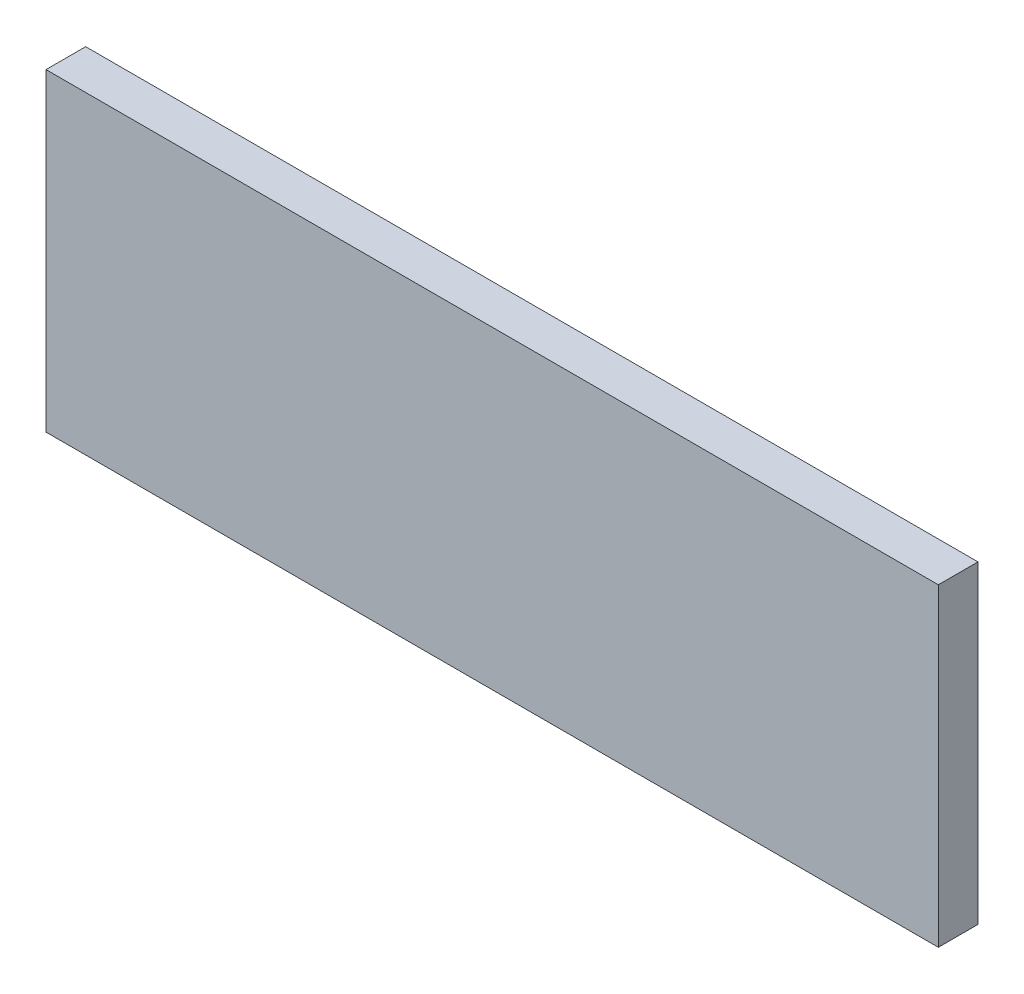
ISO-10303-21;
HEADER;
FILE_DESCRIPTION(('STEP AP214'),'2;1');
FILE_NAME('part.step','',(''),(''),'','','');
FILE_SCHEMA(('AUTOMOTIVE_DESIGN { 1 0 10303 214 1 1 1 1 }'));
ENDSEC;
DATA;
#1=APPLICATION_CONTEXT('core data for automotive mechanical design processes');
#2=APPLICATION_PROTOCOL_DEFINITION('international standard','automotive_design',2000,#1);
#3=PRODUCT_CONTEXT('',#1,'mechanical');
#4=PRODUCT('Part','Part','',(#3));
#5=PRODUCT_RELATED_PRODUCT_CATEGORY('part','',(#4));
#6=PRODUCT_DEFINITION_FORMATION('','',#4);
#7=PRODUCT_DEFINITION_CONTEXT('part definition',#1,'design');
#8=PRODUCT_DEFINITION('design','',#6,#7);
#9=PRODUCT_DEFINITION_SHAPE('','',#8);
#10=(LENGTH_UNIT() NAMED_UNIT(*) SI_UNIT(.MILLI.,.METRE.));
#11=(NAMED_UNIT(*) PLANE_ANGLE_UNIT() SI_UNIT($,.RADIAN.));
#12=(NAMED_UNIT(*) SI_UNIT($,.STERADIAN.) SOLID_ANGLE_UNIT());
#13=UNCERTAINTY_MEASURE_WITH_UNIT(LENGTH_MEASURE(1.E-05),#10,'distance_accuracy_value','');
#14=(GEOMETRIC_REPRESENTATION_CONTEXT(3) GLOBAL_UNCERTAINTY_ASSIGNED_CONTEXT((#13)) GLOBAL_UNIT_ASSIGNED_CONTEXT((#10,
#11,#12)) REPRESENTATION_CONTEXT('',''));
#15=CARTESIAN_POINT('',(0.,0.,0.));
#16=DIRECTION('',(0.,0.,1.));
#17=DIRECTION('',(1.,0.,0.));
#18=AXIS2_PLACEMENT_3D('',#15,#16,#17);
#19=CARTESIAN_POINT('',(134.999999999985,-47.5000000000029,5.99999999999993));
#20=DIRECTION('',(-1.,0.,0.));
#21=DIRECTION('',(0.,0.,0.999999999999901));
#22=AXIS2_PLACEMENT_3D('',#19,#20,#21);
#23=PLANE('',#22);
#24=DIRECTION('',(0.,0.999999999999901,0.));
#25=VECTOR('',#24,1.);
#26=CARTESIAN_POINT('',(134.999999999985,-47.5000000000038,-5.99999999999861));
#27=LINE('',#26,#25);
#28=CARTESIAN_POINT('',(134.999999999985,-47.5000000000038,-5.99999999999861));
#29=VERTEX_POINT('',#28);
#30=CARTESIAN_POINT('',(134.999999999985,47.4999999999814,-5.99999999999702));
#31=VERTEX_POINT('',#30);
#32=EDGE_CURVE('E93',#29,#31,#27,.T.);
#33=ORIENTED_EDGE('',*,*,#32,.T.);
#34=DIRECTION('',(0.,0.,-0.999999999999901));
#35=VECTOR('',#34,1.);
#36=CARTESIAN_POINT('',(134.999999999985,47.4999999999797,6.00000000000007));
#37=LINE('',#36,#35);
#38=CARTESIAN_POINT('',(134.999999999985,47.4999999999797,6.00000000000007));
#39=VERTEX_POINT('',#38);
#40=EDGE_CURVE('E11',#39,#31,#37,.T.);
#41=ORIENTED_EDGE('',*,*,#40,.F.);
#42=DIRECTION('',(0.,0.999999999999901,0.));
#43=VECTOR('',#42,1.);
#44=CARTESIAN_POINT('',(134.999999999985,-47.5000000000029,5.99999999999993));
#45=LINE('',#44,#43);
#46=CARTESIAN_POINT('',(134.999999999985,-47.5000000000029,5.99999999999993));
#47=VERTEX_POINT('',#46);
#48=EDGE_CURVE('E81',#47,#39,#45,.T.);
#49=ORIENTED_EDGE('',*,*,#48,.F.);
#50=DIRECTION('',(0.,0.,-0.999999999999901));
#51=VECTOR('',#50,1.);
#52=CARTESIAN_POINT('',(134.999999999985,-47.5000000000029,5.99999999999993));
#53=LINE('',#52,#51);
#54=EDGE_CURVE('E89',#47,#29,#53,.T.);
#55=ORIENTED_EDGE('',*,*,#54,.T.);
#56=EDGE_LOOP('',(#33,#41,#49,#55));
#57=FACE_BOUND('',#56,.T.);
#58=ADVANCED_FACE('F30',(#57),#23,.F.);
#59=CARTESIAN_POINT('',(-135.000000000015,47.4999999999808,5.9999999999988));
#60=DIRECTION('',(0.,-0.999999999999901,0.));
#61=DIRECTION('',(0.,0.,-0.999999999999901));
#62=AXIS2_PLACEMENT_3D('',#59,#60,#61);
#63=PLANE('',#62);
#64=DIRECTION('',(-1.,0.,0.));
#65=VECTOR('',#64,1.);
#66=CARTESIAN_POINT('',(-135.000000000015,47.4999999999795,-5.99999999999888));
#67=LINE('',#66,#65);
#68=CARTESIAN_POINT('',(-135.000000000015,47.4999999999795,-5.99999999999888));
#69=VERTEX_POINT('',#68);
#70=EDGE_CURVE('E85',#31,#69,#67,.T.);
#71=ORIENTED_EDGE('',*,*,#70,.T.);
#72=DIRECTION('',(0.,0.,-0.999999999999901));
#73=VECTOR('',#72,1.);
#74=CARTESIAN_POINT('',(-135.000000000015,47.4999999999808,5.9999999999988));
#75=LINE('',#74,#73);
#76=CARTESIAN_POINT('',(-135.000000000015,47.4999999999808,5.9999999999988));
#77=VERTEX_POINT('',#76);
#78=EDGE_CURVE('E38',#77,#69,#75,.T.);
#79=ORIENTED_EDGE('',*,*,#78,.F.);
#80=DIRECTION('',(-1.,0.,0.));
#81=VECTOR('',#80,1.);
#82=CARTESIAN_POINT('',(-135.000000000015,47.4999999999808,5.9999999999988));
#83=LINE('',#82,#81);
#84=EDGE_CURVE('E76',#39,#77,#83,.T.);
#85=ORIENTED_EDGE('',*,*,#84,.F.);
#86=ORIENTED_EDGE('',*,*,#40,.T.);
#87=EDGE_LOOP('',(#71,#79,#85,#86));
#88=FACE_BOUND('',#87,.T.);
#89=ADVANCED_FACE('F84',(#88),#63,.F.);
#90=CARTESIAN_POINT('',(-135.000000000015,-47.5000000000045,6.00000000000027));
#91=DIRECTION('',(1.,0.,0.));
#92=DIRECTION('',(0.,0.,-0.999999999999901));
#93=AXIS2_PLACEMENT_3D('',#90,#91,#92);
#94=PLANE('',#93);
#95=DIRECTION('',(0.,-0.999999999999901,0.));
#96=VECTOR('',#95,1.);
#97=CARTESIAN_POINT('',(-135.000000000015,-47.5000000000042,-5.99999999999949));
#98=LINE('',#97,#96);
#99=CARTESIAN_POINT('',(-135.000000000015,-47.5000000000042,-5.99999999999949));
#100=VERTEX_POINT('',#99);
#101=EDGE_CURVE('E63',#69,#100,#98,.T.);
#102=ORIENTED_EDGE('',*,*,#101,.T.);
#103=DIRECTION('',(0.,0.,-0.999999999999901));
#104=VECTOR('',#103,1.);
#105=CARTESIAN_POINT('',(-135.000000000015,-47.5000000000045,6.00000000000027));
#106=LINE('',#105,#104);
#107=CARTESIAN_POINT('',(-135.000000000015,-47.5000000000045,6.00000000000027));
#108=VERTEX_POINT('',#107);
#109=EDGE_CURVE('E86',#108,#100,#106,.T.);
#110=ORIENTED_EDGE('',*,*,#109,.F.);
#111=DIRECTION('',(0.,-0.999999999999901,0.));
#112=VECTOR('',#111,1.);
#113=CARTESIAN_POINT('',(-135.000000000015,-47.5000000000045,6.00000000000027));
#114=LINE('',#113,#112);
#115=EDGE_CURVE('E79',#77,#108,#114,.T.);
#116=ORIENTED_EDGE('',*,*,#115,.F.);
#117=ORIENTED_EDGE('',*,*,#78,.T.);
#118=EDGE_LOOP('',(#102,#110,#116,#117));
#119=FACE_BOUND('',#118,.T.);
#120=ADVANCED_FACE('F87',(#119),#94,.F.);
#121=CARTESIAN_POINT('',(-135.000000000015,-47.5000000000045,6.00000000000027));
#122=DIRECTION('',(0.,0.999999999999901,0.));
#123=DIRECTION('',(0.,0.,0.999999999999901));
#124=AXIS2_PLACEMENT_3D('',#121,#122,#123);
#125=PLANE('',#124);
#126=DIRECTION('',(1.,0.,0.));
#127=VECTOR('',#126,1.);
#128=CARTESIAN_POINT('',(-135.000000000015,-47.5000000000042,-5.99999999999949));
#129=LINE('',#128,#127);
#130=EDGE_CURVE('E69',#100,#29,#129,.T.);
#131=ORIENTED_EDGE('',*,*,#130,.T.);
#132=ORIENTED_EDGE('',*,*,#54,.F.);
#133=DIRECTION('',(1.,0.,0.));
#134=VECTOR('',#133,1.);
#135=CARTESIAN_POINT('',(-135.000000000015,-47.5000000000045,6.00000000000027));
#136=LINE('',#135,#134);
#137=EDGE_CURVE('E46',#108,#47,#136,.T.);
#138=ORIENTED_EDGE('',*,*,#137,.F.);
#139=ORIENTED_EDGE('',*,*,#109,.T.);
#140=EDGE_LOOP('',(#131,#132,#138,#139));
#141=FACE_BOUND('',#140,.T.);
#142=ADVANCED_FACE('F100',(#141),#125,.F.);
#143=CARTESIAN_POINT('',(0.,-1.57651669496772E-11,6.00000000000009));
#144=DIRECTION('',(0.,0.,-0.999999999999901));
#145=DIRECTION('',(-1.,0.,0.));
#146=AXIS2_PLACEMENT_3D('',#143,#144,#145);
#147=PLANE('',#146);
#148=ORIENTED_EDGE('',*,*,#48,.T.);
#149=ORIENTED_EDGE('',*,*,#84,.T.);
#150=ORIENTED_EDGE('',*,*,#115,.T.);
#151=ORIENTED_EDGE('',*,*,#137,.T.);
#152=EDGE_LOOP('',(#148,#149,#150,#151));
#153=FACE_BOUND('',#152,.T.);
#154=ADVANCED_FACE('F77',(#153),#147,.F.);
#155=CARTESIAN_POINT('',(0.,-1.31006316905768E-11,-5.99999999999901));
#156=DIRECTION('',(0.,0.,-0.999999999999901));
#157=DIRECTION('',(-1.,0.,0.));
#158=AXIS2_PLACEMENT_3D('',#155,#156,#157);
#159=PLANE('',#158);
#160=ORIENTED_EDGE('',*,*,#32,.F.);
#161=ORIENTED_EDGE('',*,*,#130,.F.);
#162=ORIENTED_EDGE('',*,*,#101,.F.);
#163=ORIENTED_EDGE('',*,*,#70,.F.);
#164=EDGE_LOOP('',(#160,#161,#162,#163));
#165=FACE_BOUND('',#164,.T.);
#166=ADVANCED_FACE('F103',(#165),#159,.T.);
#167=CLOSED_SHELL('',(#58,#89,#120,#142,#154,#166));
#168=MANIFOLD_SOLID_BREP('B2',#167);
#169=ADVANCED_BREP_SHAPE_REPRESENTATION('',(#18,#168),#14);
#170=SHAPE_DEFINITION_REPRESENTATION(#9,#169);
ENDSEC;
END-ISO-10303-21;
